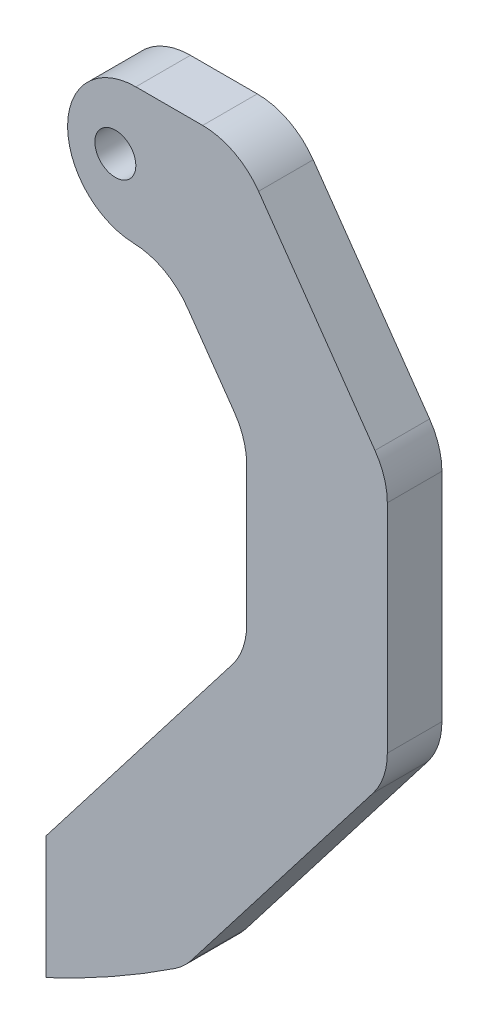
ISO-10303-21;
HEADER;
FILE_DESCRIPTION(('STEP AP214'),'2;1');
FILE_NAME('part.step','',(''),(''),'','','');
FILE_SCHEMA(('AUTOMOTIVE_DESIGN { 1 0 10303 214 1 1 1 1 }'));
ENDSEC;
DATA;
#1=APPLICATION_CONTEXT('core data for automotive mechanical design processes');
#2=APPLICATION_PROTOCOL_DEFINITION('international standard','automotive_design',2000,#1);
#3=PRODUCT_CONTEXT('',#1,'mechanical');
#4=PRODUCT('Part','Part','',(#3));
#5=PRODUCT_RELATED_PRODUCT_CATEGORY('part','',(#4));
#6=PRODUCT_DEFINITION_FORMATION('','',#4);
#7=PRODUCT_DEFINITION_CONTEXT('part definition',#1,'design');
#8=PRODUCT_DEFINITION('design','',#6,#7);
#9=PRODUCT_DEFINITION_SHAPE('','',#8);
#10=(LENGTH_UNIT() NAMED_UNIT(*) SI_UNIT(.MILLI.,.METRE.));
#11=(NAMED_UNIT(*) PLANE_ANGLE_UNIT() SI_UNIT($,.RADIAN.));
#12=(NAMED_UNIT(*) SI_UNIT($,.STERADIAN.) SOLID_ANGLE_UNIT());
#13=UNCERTAINTY_MEASURE_WITH_UNIT(LENGTH_MEASURE(1.E-05),#10,'distance_accuracy_value','');
#14=(GEOMETRIC_REPRESENTATION_CONTEXT(3) GLOBAL_UNCERTAINTY_ASSIGNED_CONTEXT((#13)) GLOBAL_UNIT_ASSIGNED_CONTEXT((#10,
#11,#12)) REPRESENTATION_CONTEXT('',''));
#15=CARTESIAN_POINT('',(0.,0.,0.));
#16=DIRECTION('',(0.,0.,1.));
#17=DIRECTION('',(1.,0.,0.));
#18=AXIS2_PLACEMENT_3D('',#15,#16,#17);
#19=CARTESIAN_POINT('',(-55.972467637369,-13.2557624114187,8.));
#20=DIRECTION('',(0.,0.,1.));
#21=DIRECTION('',(1.,0.,0.));
#22=AXIS2_PLACEMENT_3D('',#19,#20,#21);
#23=PLANE('',#22);
#24=DIRECTION('',(-1.,0.,0.));
#25=VECTOR('',#24,1.);
#26=CARTESIAN_POINT('',(10.1475516436565,-27.8731874357723,8.));
#27=LINE('',#26,#25);
#28=CARTESIAN_POINT('',(29.941881138139,-27.8731874357723,8.));
#29=VERTEX_POINT('',#28);
#30=CARTESIAN_POINT('',(20.1475516436565,-27.8731874357723,8.));
#31=VERTEX_POINT('',#30);
#32=EDGE_CURVE('E207',#29,#31,#27,.T.);
#33=ORIENTED_EDGE('',*,*,#32,.T.);
#34=CARTESIAN_POINT('',(20.1475516436565,-37.8731874357724,8.));
#35=DIRECTION('',(0.,0.,1.));
#36=DIRECTION('',(1.,0.,0.));
#37=AXIS2_PLACEMENT_3D('',#34,#35,#36);
#38=CIRCLE('',#37,10.);
#39=CARTESIAN_POINT('',(10.1475516436565,-37.8731874357724,8.));
#40=VERTEX_POINT('',#39);
#41=EDGE_CURVE('E41',#31,#40,#38,.T.);
#42=ORIENTED_EDGE('',*,*,#41,.T.);
#43=DIRECTION('',(0.,-1.,0.));
#44=VECTOR('',#43,1.);
#45=CARTESIAN_POINT('',(10.1475516436565,-47.8731874357723,8.));
#46=LINE('',#45,#44);
#47=CARTESIAN_POINT('',(10.1475516436565,-37.882707281748,8.));
#48=VERTEX_POINT('',#47);
#49=EDGE_CURVE('E209',#40,#48,#46,.T.);
#50=ORIENTED_EDGE('',*,*,#49,.T.);
#51=CARTESIAN_POINT('',(20.1475516436565,-37.882707281748,8.));
#52=DIRECTION('',(0.,0.,1.));
#53=DIRECTION('',(1.,0.,0.));
#54=AXIS2_PLACEMENT_3D('',#51,#52,#53);
#55=CIRCLE('',#54,10.);
#56=CARTESIAN_POINT('',(19.8390458853803,-47.8779473587602,8.));
#57=VERTEX_POINT('',#56);
#58=EDGE_CURVE('E48',#48,#57,#55,.T.);
#59=ORIENTED_EDGE('',*,*,#58,.T.);
#60=CARTESIAN_POINT('',(19.530540127104,-57.8731874357723,8.));
#61=DIRECTION('',(0.,0.,1.));
#62=DIRECTION('',(1.,0.,0.));
#63=AXIS2_PLACEMENT_3D('',#60,#61,#62);
#64=CIRCLE('',#63,10.);
#65=CARTESIAN_POINT('',(27.722060569994,-52.1374230722619,8.));
#66=VERTEX_POINT('',#65);
#67=EDGE_CURVE('E299',#57,#66,#64,.F.);
#68=ORIENTED_EDGE('',*,*,#67,.T.);
#69=DIRECTION('',(0.573576436351044,-0.819152044288993,0.));
#70=VECTOR('',#69,1.);
#71=CARTESIAN_POINT('',(24.7362106326215,-47.8731874357723,8.));
#72=LINE('',#71,#70);
#73=CARTESIAN_POINT('',(34.5803798144335,-61.9321180308094,8.));
#74=VERTEX_POINT('',#73);
#75=EDGE_CURVE('E211',#66,#74,#72,.T.);
#76=ORIENTED_EDGE('',*,*,#75,.T.);
#77=CARTESIAN_POINT('',(26.3888593715436,-67.6678823943198,8.));
#78=DIRECTION('',(0.,0.,1.));
#79=DIRECTION('',(1.,0.,0.));
#80=AXIS2_PLACEMENT_3D('',#77,#78,#79);
#81=CIRCLE('',#80,10.);
#82=CARTESIAN_POINT('',(36.3888593715436,-67.6678823943198,8.));
#83=VERTEX_POINT('',#82);
#84=EDGE_CURVE('E294',#74,#83,#81,.F.);
#85=ORIENTED_EDGE('',*,*,#84,.T.);
#86=DIRECTION('',(0.,-1.,0.));
#87=VECTOR('',#86,1.);
#88=CARTESIAN_POINT('',(36.3888593715436,-64.51489450553,8.));
#89=LINE('',#88,#87);
#90=CARTESIAN_POINT('',(36.3888593715436,-87.9776533458563,8.));
#91=VERTEX_POINT('',#90);
#92=EDGE_CURVE('E178',#83,#91,#89,.T.);
#93=ORIENTED_EDGE('',*,*,#92,.T.);
#94=CARTESIAN_POINT('',(26.3888593715436,-87.9776533458563,8.));
#95=DIRECTION('',(0.,0.,1.));
#96=DIRECTION('',(1.,0.,0.));
#97=AXIS2_PLACEMENT_3D('',#94,#95,#96);
#98=CIRCLE('',#97,10.);
#99=CARTESIAN_POINT('',(34.3072474373391,-94.0849547498699,8.));
#100=VERTEX_POINT('',#99);
#101=EDGE_CURVE('E174',#91,#100,#98,.F.);
#102=ORIENTED_EDGE('',*,*,#101,.T.);
#103=DIRECTION('',(-0.610730140401356,-0.791838806579559,0.));
#104=VECTOR('',#103,1.);
#105=CARTESIAN_POINT('',(6.9976263269741,-129.493093889622,8.));
#106=LINE('',#105,#104);
#107=CARTESIAN_POINT('',(6.9976263269741,-129.493093889622,8.));
#108=VERTEX_POINT('',#107);
#109=EDGE_CURVE('E165',#100,#108,#106,.T.);
#110=ORIENTED_EDGE('',*,*,#109,.T.);
#111=DIRECTION('',(0.,-1.,0.));
#112=VECTOR('',#111,1.);
#113=CARTESIAN_POINT('',(6.9976263269741,-147.493093889622,8.));
#114=LINE('',#113,#112);
#115=CARTESIAN_POINT('',(6.9976263269741,-147.493093889622,8.));
#116=VERTEX_POINT('',#115);
#117=EDGE_CURVE('E170',#108,#116,#114,.T.);
#118=ORIENTED_EDGE('',*,*,#117,.T.);
#119=CARTESIAN_POINT('',(-55.972467637369,-13.2557624114187,8.));
#120=DIRECTION('',(0.,0.,1.));
#121=DIRECTION('',(1.,0.,0.));
#122=AXIS2_PLACEMENT_3D('',#119,#120,#121);
#123=CIRCLE('',#122,148.273038332217);
#124=CARTESIAN_POINT('',(25.8667476223318,-136.897328003025,8.));
#125=VERTEX_POINT('',#124);
#126=EDGE_CURVE('E193',#116,#125,#123,.T.);
#127=ORIENTED_EDGE('',*,*,#126,.T.);
#128=CARTESIAN_POINT('',(20.3472535740387,-128.558551986675,8.));
#129=DIRECTION('',(0.,0.,1.));
#130=DIRECTION('',(1.,0.,0.));
#131=AXIS2_PLACEMENT_3D('',#128,#129,#130);
#132=CIRCLE('',#131,10.);
#133=CARTESIAN_POINT('',(28.2656416398344,-134.665853390689,8.));
#134=VERTEX_POINT('',#133);
#135=EDGE_CURVE('E257',#125,#134,#132,.T.);
#136=ORIENTED_EDGE('',*,*,#135,.T.);
#137=DIRECTION('',(0.610730140401355,0.791838806579559,0.));
#138=VECTOR('',#137,1.);
#139=CARTESIAN_POINT('',(56.9976263269741,-97.4135565736762,8.));
#140=LINE('',#139,#138);
#141=CARTESIAN_POINT('',(54.9160143927697,-100.112459085118,8.));
#142=VERTEX_POINT('',#141);
#143=EDGE_CURVE('E195',#134,#142,#140,.T.);
#144=ORIENTED_EDGE('',*,*,#143,.T.);
#145=CARTESIAN_POINT('',(46.9976263269741,-94.005157681104,8.));
#146=DIRECTION('',(0.,0.,1.));
#147=DIRECTION('',(1.,0.,0.));
#148=AXIS2_PLACEMENT_3D('',#145,#146,#147);
#149=CIRCLE('',#148,10.);
#150=CARTESIAN_POINT('',(56.9976263269741,-94.005157681104,8.));
#151=VERTEX_POINT('',#150);
#152=EDGE_CURVE('E259',#142,#151,#149,.T.);
#153=ORIENTED_EDGE('',*,*,#152,.T.);
#154=DIRECTION('',(0.,1.,0.));
#155=VECTOR('',#154,1.);
#156=CARTESIAN_POINT('',(56.9976263269741,-59.0783280419189,8.));
#157=LINE('',#156,#155);
#158=CARTESIAN_POINT('',(56.9976263269741,-62.2313159307087,8.));
#159=VERTEX_POINT('',#158);
#160=EDGE_CURVE('E201',#151,#159,#157,.T.);
#161=ORIENTED_EDGE('',*,*,#160,.T.);
#162=CARTESIAN_POINT('',(46.9976263269741,-62.2313159307087,8.));
#163=DIRECTION('',(0.,0.,1.));
#164=DIRECTION('',(1.,0.,0.));
#165=AXIS2_PLACEMENT_3D('',#162,#163,#164);
#166=CIRCLE('',#165,10.);
#167=CARTESIAN_POINT('',(55.189146769864,-56.4955515671983,8.));
#168=VERTEX_POINT('',#167);
#169=EDGE_CURVE('E261',#159,#168,#166,.T.);
#170=ORIENTED_EDGE('',*,*,#169,.T.);
#171=DIRECTION('',(-0.573576436351044,0.819152044288993,0.));
#172=VECTOR('',#171,1.);
#173=CARTESIAN_POINT('',(35.1475516436565,-27.8731874357723,8.));
#174=LINE('',#173,#172);
#175=CARTESIAN_POINT('',(38.1334015810289,-32.1374230722619,8.));
#176=VERTEX_POINT('',#175);
#177=EDGE_CURVE('E204',#168,#176,#174,.T.);
#178=ORIENTED_EDGE('',*,*,#177,.T.);
#179=CARTESIAN_POINT('',(29.941881138139,-37.8731874357724,8.));
#180=DIRECTION('',(0.,0.,1.));
#181=DIRECTION('',(1.,0.,0.));
#182=AXIS2_PLACEMENT_3D('',#179,#180,#181);
#183=CIRCLE('',#182,10.);
#184=EDGE_CURVE('E263',#176,#29,#183,.T.);
#185=ORIENTED_EDGE('',*,*,#184,.T.);
#186=EDGE_LOOP('',(#33,#42,#50,#59,#68,#76,#85,#93,#102,#110,#118,#127,#136,#144,#153,#161,#170,
#178,#185));
#187=FACE_BOUND('',#186,.T.);
#188=CARTESIAN_POINT('',(17.1475516436565,-37.8731874357724,8.));
#189=DIRECTION('',(0.,0.,1.));
#190=DIRECTION('',(1.,0.,0.));
#191=AXIS2_PLACEMENT_3D('',#188,#189,#190);
#192=CIRCLE('',#191,3.);
#193=CARTESIAN_POINT('',(20.1475516436565,-37.8731874357724,8.));
#194=VERTEX_POINT('',#193);
#195=EDGE_CURVE('E217',#194,#194,#192,.T.);
#196=ORIENTED_EDGE('',*,*,#195,.F.);
#197=EDGE_LOOP('',(#196));
#198=FACE_BOUND('',#197,.T.);
#199=ADVANCED_FACE('F33',(#187,#198),#23,.T.);
#200=CARTESIAN_POINT('',(-55.972467637369,-13.2557624114187,0.));
#201=DIRECTION('',(0.,0.,1.));
#202=DIRECTION('',(1.,0.,0.));
#203=AXIS2_PLACEMENT_3D('',#200,#201,#202);
#204=PLANE('',#203);
#205=DIRECTION('',(0.,-1.,0.));
#206=VECTOR('',#205,1.);
#207=CARTESIAN_POINT('',(10.1475516436565,-47.8731874357723,0.));
#208=LINE('',#207,#206);
#209=CARTESIAN_POINT('',(10.1475516436565,-37.8731874357724,0.));
#210=VERTEX_POINT('',#209);
#211=CARTESIAN_POINT('',(10.1475516436565,-37.882707281748,0.));
#212=VERTEX_POINT('',#211);
#213=EDGE_CURVE('E235',#210,#212,#208,.T.);
#214=ORIENTED_EDGE('',*,*,#213,.F.);
#215=CARTESIAN_POINT('',(20.1475516436565,-37.8731874357724,0.));
#216=DIRECTION('',(0.,0.,1.));
#217=DIRECTION('',(1.,0.,0.));
#218=AXIS2_PLACEMENT_3D('',#215,#216,#217);
#219=CIRCLE('',#218,10.);
#220=CARTESIAN_POINT('',(20.1475516436565,-27.8731874357723,0.));
#221=VERTEX_POINT('',#220);
#222=EDGE_CURVE('E308',#210,#221,#219,.F.);
#223=ORIENTED_EDGE('',*,*,#222,.T.);
#224=DIRECTION('',(-1.,0.,0.));
#225=VECTOR('',#224,1.);
#226=CARTESIAN_POINT('',(10.1475516436565,-27.8731874357723,0.));
#227=LINE('',#226,#225);
#228=CARTESIAN_POINT('',(29.941881138139,-27.8731874357723,0.));
#229=VERTEX_POINT('',#228);
#230=EDGE_CURVE('E233',#229,#221,#227,.T.);
#231=ORIENTED_EDGE('',*,*,#230,.F.);
#232=CARTESIAN_POINT('',(29.941881138139,-37.8731874357724,0.));
#233=DIRECTION('',(0.,0.,1.));
#234=DIRECTION('',(1.,0.,0.));
#235=AXIS2_PLACEMENT_3D('',#232,#233,#234);
#236=CIRCLE('',#235,10.);
#237=CARTESIAN_POINT('',(38.1334015810289,-32.1374230722619,0.));
#238=VERTEX_POINT('',#237);
#239=EDGE_CURVE('E250',#229,#238,#236,.F.);
#240=ORIENTED_EDGE('',*,*,#239,.T.);
#241=DIRECTION('',(-0.573576436351044,0.819152044288993,0.));
#242=VECTOR('',#241,1.);
#243=CARTESIAN_POINT('',(35.1475516436565,-27.8731874357723,0.));
#244=LINE('',#243,#242);
#245=CARTESIAN_POINT('',(55.189146769864,-56.4955515671983,0.));
#246=VERTEX_POINT('',#245);
#247=EDGE_CURVE('E230',#246,#238,#244,.T.);
#248=ORIENTED_EDGE('',*,*,#247,.F.);
#249=CARTESIAN_POINT('',(46.9976263269741,-62.2313159307087,0.));
#250=DIRECTION('',(0.,0.,1.));
#251=DIRECTION('',(1.,0.,0.));
#252=AXIS2_PLACEMENT_3D('',#249,#250,#251);
#253=CIRCLE('',#252,10.);
#254=CARTESIAN_POINT('',(56.9976263269741,-62.2313159307087,0.));
#255=VERTEX_POINT('',#254);
#256=EDGE_CURVE('E248',#246,#255,#253,.F.);
#257=ORIENTED_EDGE('',*,*,#256,.T.);
#258=DIRECTION('',(0.,1.,0.));
#259=VECTOR('',#258,1.);
#260=CARTESIAN_POINT('',(56.9976263269741,-59.0783280419189,0.));
#261=LINE('',#260,#259);
#262=CARTESIAN_POINT('',(56.9976263269741,-94.005157681104,0.));
#263=VERTEX_POINT('',#262);
#264=EDGE_CURVE('E227',#263,#255,#261,.T.);
#265=ORIENTED_EDGE('',*,*,#264,.F.);
#266=CARTESIAN_POINT('',(46.9976263269741,-94.005157681104,0.));
#267=DIRECTION('',(0.,0.,1.));
#268=DIRECTION('',(1.,0.,0.));
#269=AXIS2_PLACEMENT_3D('',#266,#267,#268);
#270=CIRCLE('',#269,10.);
#271=CARTESIAN_POINT('',(54.9160143927697,-100.112459085118,0.));
#272=VERTEX_POINT('',#271);
#273=EDGE_CURVE('E246',#263,#272,#270,.F.);
#274=ORIENTED_EDGE('',*,*,#273,.T.);
#275=DIRECTION('',(0.610730140401355,0.791838806579559,0.));
#276=VECTOR('',#275,1.);
#277=CARTESIAN_POINT('',(56.9976263269741,-97.4135565736762,0.));
#278=LINE('',#277,#276);
#279=CARTESIAN_POINT('',(28.2656416398344,-134.665853390689,0.));
#280=VERTEX_POINT('',#279);
#281=EDGE_CURVE('E224',#280,#272,#278,.T.);
#282=ORIENTED_EDGE('',*,*,#281,.F.);
#283=CARTESIAN_POINT('',(20.3472535740387,-128.558551986675,0.));
#284=DIRECTION('',(0.,0.,1.));
#285=DIRECTION('',(1.,0.,0.));
#286=AXIS2_PLACEMENT_3D('',#283,#284,#285);
#287=CIRCLE('',#286,10.);
#288=CARTESIAN_POINT('',(25.8667476223318,-136.897328003025,0.));
#289=VERTEX_POINT('',#288);
#290=EDGE_CURVE('E244',#280,#289,#287,.F.);
#291=ORIENTED_EDGE('',*,*,#290,.T.);
#292=CARTESIAN_POINT('',(-55.972467637369,-13.2557624114187,0.));
#293=DIRECTION('',(0.,0.,1.));
#294=DIRECTION('',(1.,0.,0.));
#295=AXIS2_PLACEMENT_3D('',#292,#293,#294);
#296=CIRCLE('',#295,148.273038332217);
#297=CARTESIAN_POINT('',(6.9976263269741,-147.493093889622,0.));
#298=VERTEX_POINT('',#297);
#299=EDGE_CURVE('E221',#298,#289,#296,.T.);
#300=ORIENTED_EDGE('',*,*,#299,.F.);
#301=DIRECTION('',(0.,-1.,0.));
#302=VECTOR('',#301,1.);
#303=CARTESIAN_POINT('',(6.9976263269741,-147.493093889622,0.));
#304=LINE('',#303,#302);
#305=CARTESIAN_POINT('',(6.9976263269741,-129.493093889622,0.));
#306=VERTEX_POINT('',#305);
#307=EDGE_CURVE('E219',#306,#298,#304,.T.);
#308=ORIENTED_EDGE('',*,*,#307,.F.);
#309=DIRECTION('',(-0.610730140401356,-0.791838806579559,0.));
#310=VECTOR('',#309,1.);
#311=CARTESIAN_POINT('',(6.9976263269741,-129.493093889622,0.));
#312=LINE('',#311,#310);
#313=CARTESIAN_POINT('',(34.3072474373391,-94.0849547498699,0.));
#314=VERTEX_POINT('',#313);
#315=EDGE_CURVE('E184',#314,#306,#312,.T.);
#316=ORIENTED_EDGE('',*,*,#315,.F.);
#317=CARTESIAN_POINT('',(26.3888593715436,-87.9776533458563,0.));
#318=DIRECTION('',(0.,0.,1.));
#319=DIRECTION('',(1.,0.,0.));
#320=AXIS2_PLACEMENT_3D('',#317,#318,#319);
#321=CIRCLE('',#320,10.);
#322=CARTESIAN_POINT('',(36.3888593715436,-87.9776533458563,0.));
#323=VERTEX_POINT('',#322);
#324=EDGE_CURVE('E289',#314,#323,#321,.T.);
#325=ORIENTED_EDGE('',*,*,#324,.T.);
#326=DIRECTION('',(0.,-1.,0.));
#327=VECTOR('',#326,1.);
#328=CARTESIAN_POINT('',(36.3888593715436,-64.51489450553,0.));
#329=LINE('',#328,#327);
#330=CARTESIAN_POINT('',(36.3888593715436,-67.6678823943198,0.));
#331=VERTEX_POINT('',#330);
#332=EDGE_CURVE('E214',#331,#323,#329,.T.);
#333=ORIENTED_EDGE('',*,*,#332,.F.);
#334=CARTESIAN_POINT('',(26.3888593715436,-67.6678823943198,0.));
#335=DIRECTION('',(0.,0.,1.));
#336=DIRECTION('',(1.,0.,0.));
#337=AXIS2_PLACEMENT_3D('',#334,#335,#336);
#338=CIRCLE('',#337,10.);
#339=CARTESIAN_POINT('',(34.5803798144335,-61.9321180308094,0.));
#340=VERTEX_POINT('',#339);
#341=EDGE_CURVE('E292',#331,#340,#338,.T.);
#342=ORIENTED_EDGE('',*,*,#341,.T.);
#343=DIRECTION('',(0.573576436351044,-0.819152044288993,0.));
#344=VECTOR('',#343,1.);
#345=CARTESIAN_POINT('',(24.7362106326215,-47.8731874357723,0.));
#346=LINE('',#345,#344);
#347=CARTESIAN_POINT('',(27.722060569994,-52.1374230722619,0.));
#348=VERTEX_POINT('',#347);
#349=EDGE_CURVE('E238',#348,#340,#346,.T.);
#350=ORIENTED_EDGE('',*,*,#349,.F.);
#351=CARTESIAN_POINT('',(19.530540127104,-57.8731874357723,0.));
#352=DIRECTION('',(0.,0.,1.));
#353=DIRECTION('',(1.,0.,0.));
#354=AXIS2_PLACEMENT_3D('',#351,#352,#353);
#355=CIRCLE('',#354,10.);
#356=CARTESIAN_POINT('',(19.8390458853803,-47.8779473587602,0.));
#357=VERTEX_POINT('',#356);
#358=EDGE_CURVE('E296',#348,#357,#355,.T.);
#359=ORIENTED_EDGE('',*,*,#358,.T.);
#360=CARTESIAN_POINT('',(20.1475516436565,-37.882707281748,0.));
#361=DIRECTION('',(0.,0.,1.));
#362=DIRECTION('',(1.,0.,0.));
#363=AXIS2_PLACEMENT_3D('',#360,#361,#362);
#364=CIRCLE('',#363,10.);
#365=EDGE_CURVE('E306',#357,#212,#364,.F.);
#366=ORIENTED_EDGE('',*,*,#365,.T.);
#367=EDGE_LOOP('',(#214,#223,#231,#240,#248,#257,#265,#274,#282,#291,#300,#308,#316,#325,#333,
#342,#350,#359,#366));
#368=FACE_BOUND('',#367,.T.);
#369=CARTESIAN_POINT('',(17.1475516436565,-37.8731874357724,0.));
#370=DIRECTION('',(0.,0.,1.));
#371=DIRECTION('',(1.,0.,0.));
#372=AXIS2_PLACEMENT_3D('',#369,#370,#371);
#373=CIRCLE('',#372,3.);
#374=CARTESIAN_POINT('',(20.1475516436565,-37.8731874357724,0.));
#375=VERTEX_POINT('',#374);
#376=EDGE_CURVE('E557',#375,#375,#373,.T.);
#377=ORIENTED_EDGE('',*,*,#376,.T.);
#378=EDGE_LOOP('',(#377));
#379=FACE_BOUND('',#378,.T.);
#380=ADVANCED_FACE('F322',(#368,#379),#204,.F.);
#381=CARTESIAN_POINT('',(36.3888593715436,-64.51489450553,8.));
#382=DIRECTION('',(1.,0.,0.));
#383=DIRECTION('',(0.,1.,0.));
#384=AXIS2_PLACEMENT_3D('',#381,#382,#383);
#385=PLANE('',#384);
#386=ORIENTED_EDGE('',*,*,#332,.T.);
#387=DIRECTION('',(0.,0.,-1.));
#388=VECTOR('',#387,1.);
#389=CARTESIAN_POINT('',(36.3888593715436,-87.9776533458563,8.));
#390=LINE('',#389,#388);
#391=EDGE_CURVE('E282',#323,#91,#390,.F.);
#392=ORIENTED_EDGE('',*,*,#391,.T.);
#393=ORIENTED_EDGE('',*,*,#92,.F.);
#394=DIRECTION('',(0.,0.,-1.));
#395=VECTOR('',#394,1.);
#396=CARTESIAN_POINT('',(36.3888593715436,-67.6678823943198,0.));
#397=LINE('',#396,#395);
#398=EDGE_CURVE('E279',#83,#331,#397,.T.);
#399=ORIENTED_EDGE('',*,*,#398,.T.);
#400=EDGE_LOOP('',(#386,#392,#393,#399));
#401=FACE_BOUND('',#400,.T.);
#402=ADVANCED_FACE('F373',(#401),#385,.F.);
#403=CARTESIAN_POINT('',(6.9976263269741,-129.493093889622,8.));
#404=DIRECTION('',(0.791838806579559,-0.610730140401356,0.));
#405=DIRECTION('',(0.610730140401356,0.791838806579559,0.));
#406=AXIS2_PLACEMENT_3D('',#403,#404,#405);
#407=PLANE('',#406);
#408=ORIENTED_EDGE('',*,*,#109,.F.);
#409=DIRECTION('',(0.,0.,-1.));
#410=VECTOR('',#409,1.);
#411=CARTESIAN_POINT('',(34.3072474373392,-94.0849547498699,0.));
#412=LINE('',#411,#410);
#413=EDGE_CURVE('E277',#100,#314,#412,.T.);
#414=ORIENTED_EDGE('',*,*,#413,.T.);
#415=ORIENTED_EDGE('',*,*,#315,.T.);
#416=DIRECTION('',(0.,0.,-1.));
#417=VECTOR('',#416,1.);
#418=CARTESIAN_POINT('',(6.9976263269741,-129.493093889622,8.));
#419=LINE('',#418,#417);
#420=EDGE_CURVE('E181',#108,#306,#419,.T.);
#421=ORIENTED_EDGE('',*,*,#420,.F.);
#422=EDGE_LOOP('',(#408,#414,#415,#421));
#423=FACE_BOUND('',#422,.T.);
#424=ADVANCED_FACE('F182',(#423),#407,.F.);
#425=CARTESIAN_POINT('',(6.9976263269741,-147.493093889622,8.));
#426=DIRECTION('',(1.,0.,0.));
#427=DIRECTION('',(0.,0.,-1.));
#428=AXIS2_PLACEMENT_3D('',#425,#426,#427);
#429=PLANE('',#428);
#430=ORIENTED_EDGE('',*,*,#307,.T.);
#431=DIRECTION('',(0.,0.,-1.));
#432=VECTOR('',#431,1.);
#433=CARTESIAN_POINT('',(6.9976263269741,-147.493093889622,8.));
#434=LINE('',#433,#432);
#435=EDGE_CURVE('E188',#116,#298,#434,.T.);
#436=ORIENTED_EDGE('',*,*,#435,.F.);
#437=ORIENTED_EDGE('',*,*,#117,.F.);
#438=ORIENTED_EDGE('',*,*,#420,.T.);
#439=EDGE_LOOP('',(#430,#436,#437,#438));
#440=FACE_BOUND('',#439,.T.);
#441=ADVANCED_FACE('F190',(#440),#429,.F.);
#442=CARTESIAN_POINT('',(-55.972467637369,-13.2557624114187,8.));
#443=DIRECTION('',(0.,0.,-1.));
#444=DIRECTION('',(-1.,0.,0.));
#445=AXIS2_PLACEMENT_3D('',#442,#443,#444);
#446=CYLINDRICAL_SURFACE('',#445,148.273038332217);
#447=ORIENTED_EDGE('',*,*,#299,.T.);
#448=DIRECTION('',(0.,0.,-1.));
#449=VECTOR('',#448,1.);
#450=CARTESIAN_POINT('',(25.8667476223318,-136.897328003025,8.));
#451=LINE('',#450,#449);
#452=EDGE_CURVE('E275',#289,#125,#451,.F.);
#453=ORIENTED_EDGE('',*,*,#452,.T.);
#454=ORIENTED_EDGE('',*,*,#126,.F.);
#455=ORIENTED_EDGE('',*,*,#435,.T.);
#456=EDGE_LOOP('',(#447,#453,#454,#455));
#457=FACE_BOUND('',#456,.T.);
#458=ADVANCED_FACE('F359',(#457),#446,.T.);
#459=CARTESIAN_POINT('',(56.9976263269741,-97.4135565736762,8.));
#460=DIRECTION('',(-0.791838806579559,0.610730140401355,0.));
#461=DIRECTION('',(-0.610730140401355,-0.79183880657956,0.));
#462=AXIS2_PLACEMENT_3D('',#459,#460,#461);
#463=PLANE('',#462);
#464=ORIENTED_EDGE('',*,*,#281,.T.);
#465=DIRECTION('',(0.,0.,-1.));
#466=VECTOR('',#465,1.);
#467=CARTESIAN_POINT('',(54.9160143927697,-100.112459085118,8.));
#468=LINE('',#467,#466);
#469=EDGE_CURVE('E273',#272,#142,#468,.F.);
#470=ORIENTED_EDGE('',*,*,#469,.T.);
#471=ORIENTED_EDGE('',*,*,#143,.F.);
#472=DIRECTION('',(0.,0.,-1.));
#473=VECTOR('',#472,1.);
#474=CARTESIAN_POINT('',(28.2656416398343,-134.665853390689,8.));
#475=LINE('',#474,#473);
#476=EDGE_CURVE('E270',#134,#280,#475,.T.);
#477=ORIENTED_EDGE('',*,*,#476,.T.);
#478=EDGE_LOOP('',(#464,#470,#471,#477));
#479=FACE_BOUND('',#478,.T.);
#480=ADVANCED_FACE('F350',(#479),#463,.F.);
#481=CARTESIAN_POINT('',(56.9976263269741,-59.0783280419189,8.));
#482=DIRECTION('',(-1.,0.,0.));
#483=DIRECTION('',(0.,-1.,0.));
#484=AXIS2_PLACEMENT_3D('',#481,#482,#483);
#485=PLANE('',#484);
#486=ORIENTED_EDGE('',*,*,#264,.T.);
#487=DIRECTION('',(0.,0.,-1.));
#488=VECTOR('',#487,1.);
#489=CARTESIAN_POINT('',(56.9976263269741,-62.2313159307087,8.));
#490=LINE('',#489,#488);
#491=EDGE_CURVE('E268',#255,#159,#490,.F.);
#492=ORIENTED_EDGE('',*,*,#491,.T.);
#493=ORIENTED_EDGE('',*,*,#160,.F.);
#494=DIRECTION('',(0.,0.,-1.));
#495=VECTOR('',#494,1.);
#496=CARTESIAN_POINT('',(56.9976263269741,-94.005157681104,8.));
#497=LINE('',#496,#495);
#498=EDGE_CURVE('E265',#151,#263,#497,.T.);
#499=ORIENTED_EDGE('',*,*,#498,.T.);
#500=EDGE_LOOP('',(#486,#492,#493,#499));
#501=FACE_BOUND('',#500,.T.);
#502=ADVANCED_FACE('F341',(#501),#485,.F.);
#503=CARTESIAN_POINT('',(35.1475516436565,-27.8731874357723,8.));
#504=DIRECTION('',(-0.819152044288993,-0.573576436351044,0.));
#505=DIRECTION('',(0.573576436351044,-0.819152044288993,0.));
#506=AXIS2_PLACEMENT_3D('',#503,#504,#505);
#507=PLANE('',#506);
#508=ORIENTED_EDGE('',*,*,#247,.T.);
#509=DIRECTION('',(0.,0.,-1.));
#510=VECTOR('',#509,1.);
#511=CARTESIAN_POINT('',(38.1334015810289,-32.1374230722619,8.));
#512=LINE('',#511,#510);
#513=EDGE_CURVE('E255',#238,#176,#512,.F.);
#514=ORIENTED_EDGE('',*,*,#513,.T.);
#515=ORIENTED_EDGE('',*,*,#177,.F.);
#516=DIRECTION('',(0.,0.,-1.));
#517=VECTOR('',#516,1.);
#518=CARTESIAN_POINT('',(55.189146769864,-56.4955515671983,8.));
#519=LINE('',#518,#517);
#520=EDGE_CURVE('E252',#168,#246,#519,.T.);
#521=ORIENTED_EDGE('',*,*,#520,.T.);
#522=EDGE_LOOP('',(#508,#514,#515,#521));
#523=FACE_BOUND('',#522,.T.);
#524=ADVANCED_FACE('F332',(#523),#507,.F.);
#525=CARTESIAN_POINT('',(10.1475516436565,-27.8731874357723,8.));
#526=DIRECTION('',(0.,-1.,0.));
#527=DIRECTION('',(0.,0.,-1.));
#528=AXIS2_PLACEMENT_3D('',#525,#526,#527);
#529=PLANE('',#528);
#530=ORIENTED_EDGE('',*,*,#230,.T.);
#531=DIRECTION('',(0.,0.,-1.));
#532=VECTOR('',#531,1.);
#533=CARTESIAN_POINT('',(20.1475516436565,-27.8731874357723,8.));
#534=LINE('',#533,#532);
#535=EDGE_CURVE('E56',#221,#31,#534,.F.);
#536=ORIENTED_EDGE('',*,*,#535,.T.);
#537=ORIENTED_EDGE('',*,*,#32,.F.);
#538=DIRECTION('',(0.,0.,-1.));
#539=VECTOR('',#538,1.);
#540=CARTESIAN_POINT('',(29.941881138139,-27.8731874357723,8.));
#541=LINE('',#540,#539);
#542=EDGE_CURVE('E187',#29,#229,#541,.T.);
#543=ORIENTED_EDGE('',*,*,#542,.T.);
#544=EDGE_LOOP('',(#530,#536,#537,#543));
#545=FACE_BOUND('',#544,.T.);
#546=ADVANCED_FACE('F324',(#545),#529,.F.);
#547=CARTESIAN_POINT('',(10.1475516436565,-47.8731874357723,8.));
#548=DIRECTION('',(1.,0.,0.));
#549=DIRECTION('',(0.,1.,0.));
#550=AXIS2_PLACEMENT_3D('',#547,#548,#549);
#551=PLANE('',#550);
#552=ORIENTED_EDGE('',*,*,#49,.F.);
#553=DIRECTION('',(0.,0.,-1.));
#554=VECTOR('',#553,1.);
#555=CARTESIAN_POINT('',(10.1475516436565,-37.8731874357724,8.));
#556=LINE('',#555,#554);
#557=EDGE_CURVE('E303',#40,#210,#556,.T.);
#558=ORIENTED_EDGE('',*,*,#557,.T.);
#559=ORIENTED_EDGE('',*,*,#213,.T.);
#560=DIRECTION('',(0.,0.,1.));
#561=VECTOR('',#560,1.);
#562=CARTESIAN_POINT('',(10.1475516436565,-37.882707281748,8.));
#563=LINE('',#562,#561);
#564=EDGE_CURVE('E301',#212,#48,#563,.T.);
#565=ORIENTED_EDGE('',*,*,#564,.T.);
#566=EDGE_LOOP('',(#552,#558,#559,#565));
#567=FACE_BOUND('',#566,.T.);
#568=ADVANCED_FACE('F316',(#567),#551,.F.);
#569=CARTESIAN_POINT('',(24.7362106326215,-47.8731874357723,8.));
#570=DIRECTION('',(0.819152044288993,0.573576436351044,0.));
#571=DIRECTION('',(-0.573576436351044,0.819152044288993,0.));
#572=AXIS2_PLACEMENT_3D('',#569,#570,#571);
#573=PLANE('',#572);
#574=ORIENTED_EDGE('',*,*,#349,.T.);
#575=DIRECTION('',(0.,0.,-1.));
#576=VECTOR('',#575,1.);
#577=CARTESIAN_POINT('',(34.5803798144335,-61.9321180308094,8.));
#578=LINE('',#577,#576);
#579=EDGE_CURVE('E287',#340,#74,#578,.F.);
#580=ORIENTED_EDGE('',*,*,#579,.T.);
#581=ORIENTED_EDGE('',*,*,#75,.F.);
#582=DIRECTION('',(0.,0.,-1.));
#583=VECTOR('',#582,1.);
#584=CARTESIAN_POINT('',(27.722060569994,-52.1374230722619,0.));
#585=LINE('',#584,#583);
#586=EDGE_CURVE('E284',#66,#348,#585,.T.);
#587=ORIENTED_EDGE('',*,*,#586,.T.);
#588=EDGE_LOOP('',(#574,#580,#581,#587));
#589=FACE_BOUND('',#588,.T.);
#590=ADVANCED_FACE('F378',(#589),#573,.F.);
#591=CARTESIAN_POINT('',(17.1475516436565,-37.8731874357724,8.));
#592=DIRECTION('',(0.,0.,-1.));
#593=DIRECTION('',(-1.,0.,0.));
#594=AXIS2_PLACEMENT_3D('',#591,#592,#593);
#595=CYLINDRICAL_SURFACE('',#594,3.);
#596=ORIENTED_EDGE('',*,*,#195,.T.);
#597=EDGE_LOOP('',(#596));
#598=FACE_BOUND('',#597,.T.);
#599=ORIENTED_EDGE('',*,*,#376,.F.);
#600=EDGE_LOOP('',(#599));
#601=FACE_BOUND('',#600,.T.);
#602=ADVANCED_FACE('F376',(#598,#601),#595,.F.);
#603=CARTESIAN_POINT('',(29.941881138139,-37.8731874357724,8.));
#604=DIRECTION('',(0.,0.,-1.));
#605=DIRECTION('',(-1.,0.,0.));
#606=AXIS2_PLACEMENT_3D('',#603,#604,#605);
#607=CYLINDRICAL_SURFACE('',#606,10.);
#608=ORIENTED_EDGE('',*,*,#184,.F.);
#609=ORIENTED_EDGE('',*,*,#513,.F.);
#610=ORIENTED_EDGE('',*,*,#239,.F.);
#611=ORIENTED_EDGE('',*,*,#542,.F.);
#612=EDGE_LOOP('',(#608,#609,#610,#611));
#613=FACE_BOUND('',#612,.T.);
#614=ADVANCED_FACE('F328',(#613),#607,.T.);
#615=CARTESIAN_POINT('',(46.9976263269741,-62.2313159307087,8.));
#616=DIRECTION('',(0.,0.,-1.));
#617=DIRECTION('',(-1.,0.,0.));
#618=AXIS2_PLACEMENT_3D('',#615,#616,#617);
#619=CYLINDRICAL_SURFACE('',#618,10.);
#620=ORIENTED_EDGE('',*,*,#169,.F.);
#621=ORIENTED_EDGE('',*,*,#491,.F.);
#622=ORIENTED_EDGE('',*,*,#256,.F.);
#623=ORIENTED_EDGE('',*,*,#520,.F.);
#624=EDGE_LOOP('',(#620,#621,#622,#623));
#625=FACE_BOUND('',#624,.T.);
#626=ADVANCED_FACE('F337',(#625),#619,.T.);
#627=CARTESIAN_POINT('',(46.9976263269741,-94.005157681104,8.));
#628=DIRECTION('',(0.,0.,-1.));
#629=DIRECTION('',(-1.,0.,0.));
#630=AXIS2_PLACEMENT_3D('',#627,#628,#629);
#631=CYLINDRICAL_SURFACE('',#630,10.);
#632=ORIENTED_EDGE('',*,*,#152,.F.);
#633=ORIENTED_EDGE('',*,*,#469,.F.);
#634=ORIENTED_EDGE('',*,*,#273,.F.);
#635=ORIENTED_EDGE('',*,*,#498,.F.);
#636=EDGE_LOOP('',(#632,#633,#634,#635));
#637=FACE_BOUND('',#636,.T.);
#638=ADVANCED_FACE('F346',(#637),#631,.T.);
#639=CARTESIAN_POINT('',(20.3472535740387,-128.558551986675,8.));
#640=DIRECTION('',(0.,0.,-1.));
#641=DIRECTION('',(-1.,0.,0.));
#642=AXIS2_PLACEMENT_3D('',#639,#640,#641);
#643=CYLINDRICAL_SURFACE('',#642,10.);
#644=ORIENTED_EDGE('',*,*,#135,.F.);
#645=ORIENTED_EDGE('',*,*,#452,.F.);
#646=ORIENTED_EDGE('',*,*,#290,.F.);
#647=ORIENTED_EDGE('',*,*,#476,.F.);
#648=EDGE_LOOP('',(#644,#645,#646,#647));
#649=FACE_BOUND('',#648,.T.);
#650=ADVANCED_FACE('F355',(#649),#643,.T.);
#651=CARTESIAN_POINT('',(26.3888593715436,-87.9776533458563,8.));
#652=DIRECTION('',(0.,0.,1.));
#653=DIRECTION('',(1.,0.,0.));
#654=AXIS2_PLACEMENT_3D('',#651,#652,#653);
#655=CYLINDRICAL_SURFACE('',#654,10.);
#656=ORIENTED_EDGE('',*,*,#101,.F.);
#657=ORIENTED_EDGE('',*,*,#391,.F.);
#658=ORIENTED_EDGE('',*,*,#324,.F.);
#659=ORIENTED_EDGE('',*,*,#413,.F.);
#660=EDGE_LOOP('',(#656,#657,#658,#659));
#661=FACE_BOUND('',#660,.T.);
#662=ADVANCED_FACE('F443',(#661),#655,.F.);
#663=CARTESIAN_POINT('',(26.3888593715436,-67.6678823943198,8.));
#664=DIRECTION('',(0.,0.,1.));
#665=DIRECTION('',(1.,0.,0.));
#666=AXIS2_PLACEMENT_3D('',#663,#664,#665);
#667=CYLINDRICAL_SURFACE('',#666,10.);
#668=ORIENTED_EDGE('',*,*,#84,.F.);
#669=ORIENTED_EDGE('',*,*,#579,.F.);
#670=ORIENTED_EDGE('',*,*,#341,.F.);
#671=ORIENTED_EDGE('',*,*,#398,.F.);
#672=EDGE_LOOP('',(#668,#669,#670,#671));
#673=FACE_BOUND('',#672,.T.);
#674=ADVANCED_FACE('F450',(#673),#667,.F.);
#675=CARTESIAN_POINT('',(19.530540127104,-57.8731874357723,8.));
#676=DIRECTION('',(0.,0.,1.));
#677=DIRECTION('',(1.,0.,0.));
#678=AXIS2_PLACEMENT_3D('',#675,#676,#677);
#679=CYLINDRICAL_SURFACE('',#678,10.);
#680=ORIENTED_EDGE('',*,*,#67,.F.);
#681=DIRECTION('',(0.,0.,1.));
#682=VECTOR('',#681,1.);
#683=CARTESIAN_POINT('',(19.8390458853803,-47.8779473587602,8.));
#684=LINE('',#683,#682);
#685=EDGE_CURVE('E11',#57,#357,#684,.F.);
#686=ORIENTED_EDGE('',*,*,#685,.T.);
#687=ORIENTED_EDGE('',*,*,#358,.F.);
#688=ORIENTED_EDGE('',*,*,#586,.F.);
#689=EDGE_LOOP('',(#680,#686,#687,#688));
#690=FACE_BOUND('',#689,.T.);
#691=ADVANCED_FACE('F458',(#690),#679,.F.);
#692=CARTESIAN_POINT('',(20.1475516436565,-37.8731874357724,8.));
#693=DIRECTION('',(0.,0.,-1.));
#694=DIRECTION('',(-1.,0.,0.));
#695=AXIS2_PLACEMENT_3D('',#692,#693,#694);
#696=CYLINDRICAL_SURFACE('',#695,10.);
#697=ORIENTED_EDGE('',*,*,#41,.F.);
#698=ORIENTED_EDGE('',*,*,#535,.F.);
#699=ORIENTED_EDGE('',*,*,#222,.F.);
#700=ORIENTED_EDGE('',*,*,#557,.F.);
#701=EDGE_LOOP('',(#697,#698,#699,#700));
#702=FACE_BOUND('',#701,.T.);
#703=ADVANCED_FACE('F319',(#702),#696,.T.);
#704=CARTESIAN_POINT('',(20.1475516436565,-37.882707281748,8.));
#705=DIRECTION('',(0.,0.,1.));
#706=DIRECTION('',(1.,0.,0.));
#707=AXIS2_PLACEMENT_3D('',#704,#705,#706);
#708=CYLINDRICAL_SURFACE('',#707,10.);
#709=ORIENTED_EDGE('',*,*,#58,.F.);
#710=ORIENTED_EDGE('',*,*,#564,.F.);
#711=ORIENTED_EDGE('',*,*,#365,.F.);
#712=ORIENTED_EDGE('',*,*,#685,.F.);
#713=EDGE_LOOP('',(#709,#710,#711,#712));
#714=FACE_BOUND('',#713,.T.);
#715=ADVANCED_FACE('F35',(#714),#708,.T.);
#716=CLOSED_SHELL('',(#199,#380,#402,#424,#441,#458,#480,#502,#524,#546,#568,#590,#602,#614,
#626,#638,#650,#662,#674,#691,#703,#715));
#717=MANIFOLD_SOLID_BREP('B2',#716);
#718=ADVANCED_BREP_SHAPE_REPRESENTATION('',(#18,#717),#14);
#719=SHAPE_DEFINITION_REPRESENTATION(#9,#718);
ENDSEC;
END-ISO-10303-21;
